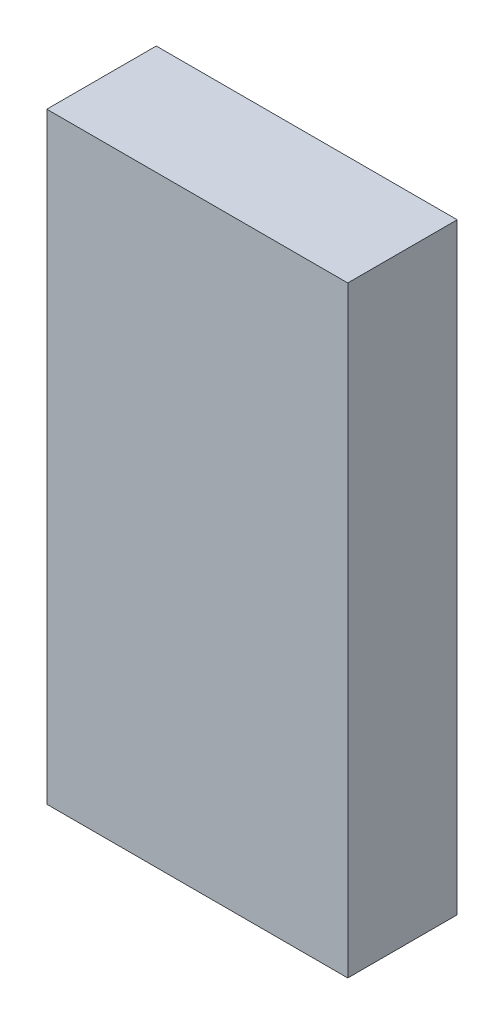
ISO-10303-21;
HEADER;
FILE_DESCRIPTION(('STEP AP214'),'2;1');
FILE_NAME('part.step','',(''),(''),'','','');
FILE_SCHEMA(('AUTOMOTIVE_DESIGN { 1 0 10303 214 1 1 1 1 }'));
ENDSEC;
DATA;
#1=APPLICATION_CONTEXT('core data for automotive mechanical design processes');
#2=APPLICATION_PROTOCOL_DEFINITION('international standard','automotive_design',2000,#1);
#3=PRODUCT_CONTEXT('',#1,'mechanical');
#4=PRODUCT('Part','Part','',(#3));
#5=PRODUCT_RELATED_PRODUCT_CATEGORY('part','',(#4));
#6=PRODUCT_DEFINITION_FORMATION('','',#4);
#7=PRODUCT_DEFINITION_CONTEXT('part definition',#1,'design');
#8=PRODUCT_DEFINITION('design','',#6,#7);
#9=PRODUCT_DEFINITION_SHAPE('','',#8);
#10=(LENGTH_UNIT() NAMED_UNIT(*) SI_UNIT(.MILLI.,.METRE.));
#11=(NAMED_UNIT(*) PLANE_ANGLE_UNIT() SI_UNIT($,.RADIAN.));
#12=(NAMED_UNIT(*) SI_UNIT($,.STERADIAN.) SOLID_ANGLE_UNIT());
#13=UNCERTAINTY_MEASURE_WITH_UNIT(LENGTH_MEASURE(1.E-05),#10,'distance_accuracy_value','');
#14=(GEOMETRIC_REPRESENTATION_CONTEXT(3) GLOBAL_UNCERTAINTY_ASSIGNED_CONTEXT((#13)) GLOBAL_UNIT_ASSIGNED_CONTEXT((#10,
#11,#12)) REPRESENTATION_CONTEXT('',''));
#15=CARTESIAN_POINT('',(0.,0.,0.));
#16=DIRECTION('',(0.,0.,1.));
#17=DIRECTION('',(1.,0.,0.));
#18=AXIS2_PLACEMENT_3D('',#15,#16,#17);
#19=CARTESIAN_POINT('',(0.,0.,40.));
#20=DIRECTION('',(1.,0.,0.));
#21=DIRECTION('',(0.,0.,-1.));
#22=AXIS2_PLACEMENT_3D('',#19,#20,#21);
#23=PLANE('',#22);
#24=DIRECTION('',(0.,-1.,0.));
#25=VECTOR('',#24,1.);
#26=CARTESIAN_POINT('',(0.,0.,0.));
#27=LINE('',#26,#25);
#28=CARTESIAN_POINT('',(0.,220.,0.));
#29=VERTEX_POINT('',#28);
#30=CARTESIAN_POINT('',(0.,0.,0.));
#31=VERTEX_POINT('',#30);
#32=EDGE_CURVE('E97',#29,#31,#27,.T.);
#33=ORIENTED_EDGE('',*,*,#32,.T.);
#34=DIRECTION('',(0.,0.,-1.));
#35=VECTOR('',#34,1.);
#36=CARTESIAN_POINT('',(0.,0.,40.));
#37=LINE('',#36,#35);
#38=CARTESIAN_POINT('',(0.,0.,40.));
#39=VERTEX_POINT('',#38);
#40=EDGE_CURVE('E11',#39,#31,#37,.T.);
#41=ORIENTED_EDGE('',*,*,#40,.F.);
#42=DIRECTION('',(0.,-1.,0.));
#43=VECTOR('',#42,1.);
#44=CARTESIAN_POINT('',(0.,0.,40.));
#45=LINE('',#44,#43);
#46=CARTESIAN_POINT('',(0.,220.,40.));
#47=VERTEX_POINT('',#46);
#48=EDGE_CURVE('E85',#47,#39,#45,.T.);
#49=ORIENTED_EDGE('',*,*,#48,.F.);
#50=DIRECTION('',(0.,0.,-1.));
#51=VECTOR('',#50,1.);
#52=CARTESIAN_POINT('',(0.,220.,40.));
#53=LINE('',#52,#51);
#54=EDGE_CURVE('E93',#47,#29,#53,.T.);
#55=ORIENTED_EDGE('',*,*,#54,.T.);
#56=EDGE_LOOP('',(#33,#41,#49,#55));
#57=FACE_BOUND('',#56,.T.);
#58=ADVANCED_FACE('F34',(#57),#23,.F.);
#59=CARTESIAN_POINT('',(0.,0.,40.));
#60=DIRECTION('',(0.,1.,0.));
#61=DIRECTION('',(0.,0.,1.));
#62=AXIS2_PLACEMENT_3D('',#59,#60,#61);
#63=PLANE('',#62);
#64=DIRECTION('',(1.,0.,0.));
#65=VECTOR('',#64,1.);
#66=CARTESIAN_POINT('',(0.,0.,0.));
#67=LINE('',#66,#65);
#68=CARTESIAN_POINT('',(110.,0.,0.));
#69=VERTEX_POINT('',#68);
#70=EDGE_CURVE('E89',#31,#69,#67,.T.);
#71=ORIENTED_EDGE('',*,*,#70,.T.);
#72=DIRECTION('',(0.,0.,-1.));
#73=VECTOR('',#72,1.);
#74=CARTESIAN_POINT('',(110.,0.,40.));
#75=LINE('',#74,#73);
#76=CARTESIAN_POINT('',(110.,0.,40.));
#77=VERTEX_POINT('',#76);
#78=EDGE_CURVE('E42',#77,#69,#75,.T.);
#79=ORIENTED_EDGE('',*,*,#78,.F.);
#80=DIRECTION('',(1.,0.,0.));
#81=VECTOR('',#80,1.);
#82=CARTESIAN_POINT('',(0.,0.,40.));
#83=LINE('',#82,#81);
#84=EDGE_CURVE('E80',#39,#77,#83,.T.);
#85=ORIENTED_EDGE('',*,*,#84,.F.);
#86=ORIENTED_EDGE('',*,*,#40,.T.);
#87=EDGE_LOOP('',(#71,#79,#85,#86));
#88=FACE_BOUND('',#87,.T.);
#89=ADVANCED_FACE('F88',(#88),#63,.F.);
#90=CARTESIAN_POINT('',(110.,0.,40.));
#91=DIRECTION('',(-1.,0.,0.));
#92=DIRECTION('',(0.,0.,1.));
#93=AXIS2_PLACEMENT_3D('',#90,#91,#92);
#94=PLANE('',#93);
#95=DIRECTION('',(0.,1.,0.));
#96=VECTOR('',#95,1.);
#97=CARTESIAN_POINT('',(110.,0.,0.));
#98=LINE('',#97,#96);
#99=CARTESIAN_POINT('',(110.,220.,0.));
#100=VERTEX_POINT('',#99);
#101=EDGE_CURVE('E67',#69,#100,#98,.T.);
#102=ORIENTED_EDGE('',*,*,#101,.T.);
#103=DIRECTION('',(0.,0.,-1.));
#104=VECTOR('',#103,1.);
#105=CARTESIAN_POINT('',(110.,220.,40.));
#106=LINE('',#105,#104);
#107=CARTESIAN_POINT('',(110.,220.,40.));
#108=VERTEX_POINT('',#107);
#109=EDGE_CURVE('E90',#108,#100,#106,.T.);
#110=ORIENTED_EDGE('',*,*,#109,.F.);
#111=DIRECTION('',(0.,1.,0.));
#112=VECTOR('',#111,1.);
#113=CARTESIAN_POINT('',(110.,0.,40.));
#114=LINE('',#113,#112);
#115=EDGE_CURVE('E83',#77,#108,#114,.T.);
#116=ORIENTED_EDGE('',*,*,#115,.F.);
#117=ORIENTED_EDGE('',*,*,#78,.T.);
#118=EDGE_LOOP('',(#102,#110,#116,#117));
#119=FACE_BOUND('',#118,.T.);
#120=ADVANCED_FACE('F91',(#119),#94,.F.);
#121=CARTESIAN_POINT('',(0.,220.,40.));
#122=DIRECTION('',(0.,-1.,0.));
#123=DIRECTION('',(0.,0.,-1.));
#124=AXIS2_PLACEMENT_3D('',#121,#122,#123);
#125=PLANE('',#124);
#126=DIRECTION('',(-1.,0.,0.));
#127=VECTOR('',#126,1.);
#128=CARTESIAN_POINT('',(0.,220.,0.));
#129=LINE('',#128,#127);
#130=EDGE_CURVE('E73',#100,#29,#129,.T.);
#131=ORIENTED_EDGE('',*,*,#130,.T.);
#132=ORIENTED_EDGE('',*,*,#54,.F.);
#133=DIRECTION('',(-1.,0.,0.));
#134=VECTOR('',#133,1.);
#135=CARTESIAN_POINT('',(0.,220.,40.));
#136=LINE('',#135,#134);
#137=EDGE_CURVE('E50',#108,#47,#136,.T.);
#138=ORIENTED_EDGE('',*,*,#137,.F.);
#139=ORIENTED_EDGE('',*,*,#109,.T.);
#140=EDGE_LOOP('',(#131,#132,#138,#139));
#141=FACE_BOUND('',#140,.T.);
#142=ADVANCED_FACE('F104',(#141),#125,.F.);
#143=CARTESIAN_POINT('',(0.,0.,40.));
#144=DIRECTION('',(0.,0.,-1.));
#145=DIRECTION('',(-1.,0.,0.));
#146=AXIS2_PLACEMENT_3D('',#143,#144,#145);
#147=PLANE('',#146);
#148=ORIENTED_EDGE('',*,*,#48,.T.);
#149=ORIENTED_EDGE('',*,*,#84,.T.);
#150=ORIENTED_EDGE('',*,*,#115,.T.);
#151=ORIENTED_EDGE('',*,*,#137,.T.);
#152=EDGE_LOOP('',(#148,#149,#150,#151));
#153=FACE_BOUND('',#152,.T.);
#154=ADVANCED_FACE('F81',(#153),#147,.F.);
#155=CARTESIAN_POINT('',(0.,0.,0.));
#156=DIRECTION('',(0.,0.,-1.));
#157=DIRECTION('',(-1.,0.,0.));
#158=AXIS2_PLACEMENT_3D('',#155,#156,#157);
#159=PLANE('',#158);
#160=ORIENTED_EDGE('',*,*,#32,.F.);
#161=ORIENTED_EDGE('',*,*,#130,.F.);
#162=ORIENTED_EDGE('',*,*,#101,.F.);
#163=ORIENTED_EDGE('',*,*,#70,.F.);
#164=EDGE_LOOP('',(#160,#161,#162,#163));
#165=FACE_BOUND('',#164,.T.);
#166=ADVANCED_FACE('F107',(#165),#159,.T.);
#167=CLOSED_SHELL('',(#58,#89,#120,#142,#154,#166));
#168=MANIFOLD_SOLID_BREP('B2',#167);
#169=ADVANCED_BREP_SHAPE_REPRESENTATION('',(#18,#168),#14);
#170=SHAPE_DEFINITION_REPRESENTATION(#9,#169);
ENDSEC;
END-ISO-10303-21;
